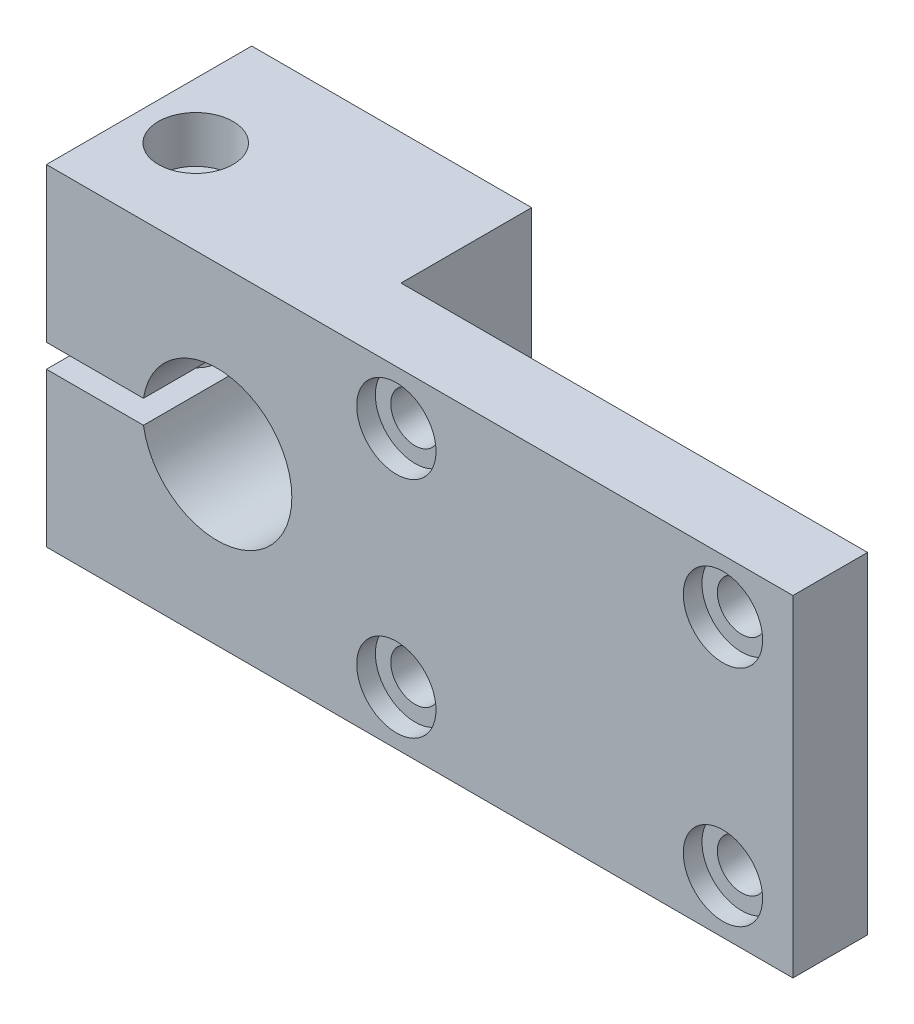
ISO-10303-21;
HEADER;
FILE_DESCRIPTION(('STEP AP214'),'2;1');
FILE_NAME('part.step','',(''),(''),'','','');
FILE_SCHEMA(('AUTOMOTIVE_DESIGN { 1 0 10303 214 1 1 1 1 }'));
ENDSEC;
DATA;
#1=APPLICATION_CONTEXT('core data for automotive mechanical design processes');
#2=APPLICATION_PROTOCOL_DEFINITION('international standard','automotive_design',2000,#1);
#3=PRODUCT_CONTEXT('',#1,'mechanical');
#4=PRODUCT('Part','Part','',(#3));
#5=PRODUCT_RELATED_PRODUCT_CATEGORY('part','',(#4));
#6=PRODUCT_DEFINITION_FORMATION('','',#4);
#7=PRODUCT_DEFINITION_CONTEXT('part definition',#1,'design');
#8=PRODUCT_DEFINITION('design','',#6,#7);
#9=PRODUCT_DEFINITION_SHAPE('','',#8);
#10=(LENGTH_UNIT() NAMED_UNIT(*) SI_UNIT(.MILLI.,.METRE.));
#11=(NAMED_UNIT(*) PLANE_ANGLE_UNIT() SI_UNIT($,.RADIAN.));
#12=(NAMED_UNIT(*) SI_UNIT($,.STERADIAN.) SOLID_ANGLE_UNIT());
#13=UNCERTAINTY_MEASURE_WITH_UNIT(LENGTH_MEASURE(1.E-05),#10,'distance_accuracy_value','');
#14=(GEOMETRIC_REPRESENTATION_CONTEXT(3) GLOBAL_UNCERTAINTY_ASSIGNED_CONTEXT((#13)) GLOBAL_UNIT_ASSIGNED_CONTEXT((#10,
#11,#12)) REPRESENTATION_CONTEXT('',''));
#15=CARTESIAN_POINT('',(0.,0.,0.));
#16=DIRECTION('',(0.,0.,1.));
#17=DIRECTION('',(1.,0.,0.));
#18=AXIS2_PLACEMENT_3D('',#15,#16,#17);
#19=CARTESIAN_POINT('',(-48.9999999999971,0.,-2.));
#20=DIRECTION('',(0.,1.,0.));
#21=DIRECTION('',(0.,0.,1.));
#22=AXIS2_PLACEMENT_3D('',#19,#20,#21);
#23=CYLINDRICAL_SURFACE('',#22,2.65);
#24=CARTESIAN_POINT('',(-48.9999999999971,-14.4999999999999,-2.));
#25=DIRECTION('',(0.,1.,0.));
#26=DIRECTION('',(0.,0.,1.));
#27=AXIS2_PLACEMENT_3D('',#24,#25,#26);
#28=CIRCLE('',#27,2.65);
#29=CARTESIAN_POINT('',(-48.9999999999971,-14.4999999999999,0.649999999999996));
#30=VERTEX_POINT('',#29);
#31=EDGE_CURVE('E296',#30,#30,#28,.T.);
#32=ORIENTED_EDGE('',*,*,#31,.F.);
#33=EDGE_LOOP('',(#32));
#34=FACE_BOUND('',#33,.T.);
#35=CARTESIAN_POINT('',(-48.9999999999971,-3.,-2.));
#36=DIRECTION('',(0.,1.,0.));
#37=DIRECTION('',(-1.,0.,0.));
#38=AXIS2_PLACEMENT_3D('',#35,#36,#37);
#39=CIRCLE('',#38,2.65);
#40=CARTESIAN_POINT('',(-51.6499999999971,-3.,-2.));
#41=VERTEX_POINT('',#40);
#42=EDGE_CURVE('E240',#41,#41,#39,.F.);
#43=ORIENTED_EDGE('',*,*,#42,.F.);
#44=EDGE_LOOP('',(#43));
#45=FACE_BOUND('',#44,.T.);
#46=ADVANCED_FACE('F36',(#34,#45),#23,.F.);
#47=CARTESIAN_POINT('',(-48.9999999999971,-16.9999999999999,-2.));
#48=DIRECTION('',(0.,-1.,0.));
#49=DIRECTION('',(0.,0.,-1.));
#50=AXIS2_PLACEMENT_3D('',#47,#48,#49);
#51=CIRCLE('',#50,2.65);
#52=CARTESIAN_POINT('',(-48.9999999999971,-16.9999999999999,-4.65));
#53=VERTEX_POINT('',#52);
#54=EDGE_CURVE('E301',#53,#53,#51,.T.);
#55=ORIENTED_EDGE('',*,*,#54,.F.);
#56=EDGE_LOOP('',(#55));
#57=FACE_BOUND('',#56,.T.);
#58=CARTESIAN_POINT('',(-48.9999999999971,-23.4999999999999,-2.));
#59=DIRECTION('',(0.,-1.,0.));
#60=DIRECTION('',(0.,0.,-1.));
#61=AXIS2_PLACEMENT_3D('',#58,#59,#60);
#62=CIRCLE('',#61,2.65);
#63=CARTESIAN_POINT('',(-48.9999999999971,-23.4999999999999,-4.65));
#64=VERTEX_POINT('',#63);
#65=EDGE_CURVE('E281',#64,#64,#62,.F.);
#66=ORIENTED_EDGE('',*,*,#65,.F.);
#67=EDGE_LOOP('',(#66));
#68=FACE_BOUND('',#67,.T.);
#69=ADVANCED_FACE('F462',(#57,#68),#23,.F.);
#70=CARTESIAN_POINT('',(-54.9999999999971,0.,0.));
#71=DIRECTION('',(-1.,0.,0.));
#72=DIRECTION('',(0.,-1.,0.));
#73=AXIS2_PLACEMENT_3D('',#70,#71,#72);
#74=PLANE('',#73);
#75=DIRECTION('',(0.,-1.,0.));
#76=VECTOR('',#75,1.);
#77=CARTESIAN_POINT('',(-54.9999999999971,26.5000000000001,-14.));
#78=LINE('',#77,#76);
#79=CARTESIAN_POINT('',(-54.9999999999971,2.,-14.));
#80=VERTEX_POINT('',#79);
#81=CARTESIAN_POINT('',(-54.9999999999971,-14.4999999999999,-14.));
#82=VERTEX_POINT('',#81);
#83=EDGE_CURVE('E244',#80,#82,#78,.T.);
#84=ORIENTED_EDGE('',*,*,#83,.T.);
#85=DIRECTION('',(0.,0.,1.));
#86=VECTOR('',#85,1.);
#87=CARTESIAN_POINT('',(-54.9999999999971,-14.4999999999999,-48.));
#88=LINE('',#87,#86);
#89=CARTESIAN_POINT('',(-54.9999999999971,-14.4999999999999,8.));
#90=VERTEX_POINT('',#89);
#91=EDGE_CURVE('E309',#82,#90,#88,.T.);
#92=ORIENTED_EDGE('',*,*,#91,.T.);
#93=DIRECTION('',(0.,1.,0.));
#94=VECTOR('',#93,1.);
#95=CARTESIAN_POINT('',(-54.9999999999971,-31.4999999999999,8.));
#96=LINE('',#95,#94);
#97=CARTESIAN_POINT('',(-54.9999999999971,2.,8.));
#98=VERTEX_POINT('',#97);
#99=EDGE_CURVE('E317',#90,#98,#96,.T.);
#100=ORIENTED_EDGE('',*,*,#99,.T.);
#101=DIRECTION('',(0.,0.,1.));
#102=VECTOR('',#101,1.);
#103=CARTESIAN_POINT('',(-54.9999999999971,2.,-14.));
#104=LINE('',#103,#102);
#105=EDGE_CURVE('E189',#80,#98,#104,.T.);
#106=ORIENTED_EDGE('',*,*,#105,.F.);
#107=EDGE_LOOP('',(#84,#92,#100,#106));
#108=FACE_BOUND('',#107,.T.);
#109=ADVANCED_FACE('F418',(#108),#74,.T.);
#110=CARTESIAN_POINT('',(0.,0.,8.));
#111=DIRECTION('',(0.,0.,1.));
#112=DIRECTION('',(1.,0.,0.));
#113=AXIS2_PLACEMENT_3D('',#110,#111,#112);
#114=PLANE('',#113);
#115=CARTESIAN_POINT('',(-17.4999999999971,-27.7499999999999,8.));
#116=DIRECTION('',(0.,0.,1.));
#117=DIRECTION('',(1.,0.,0.));
#118=AXIS2_PLACEMENT_3D('',#115,#116,#117);
#119=CIRCLE('',#118,4.25);
#120=CARTESIAN_POINT('',(-13.2499999999971,-27.7499999999999,8.));
#121=VERTEX_POINT('',#120);
#122=EDGE_CURVE('E381',#121,#121,#119,.T.);
#123=ORIENTED_EDGE('',*,*,#122,.F.);
#124=EDGE_LOOP('',(#123));
#125=FACE_BOUND('',#124,.T.);
#126=CARTESIAN_POINT('',(17.5000000000029,-27.7499999999999,8.));
#127=DIRECTION('',(0.,0.,1.));
#128=DIRECTION('',(1.,0.,0.));
#129=AXIS2_PLACEMENT_3D('',#126,#127,#128);
#130=CIRCLE('',#129,4.25);
#131=CARTESIAN_POINT('',(21.7500000000029,-27.7499999999999,8.));
#132=VERTEX_POINT('',#131);
#133=EDGE_CURVE('E380',#132,#132,#130,.T.);
#134=ORIENTED_EDGE('',*,*,#133,.F.);
#135=EDGE_LOOP('',(#134));
#136=FACE_BOUND('',#135,.T.);
#137=CARTESIAN_POINT('',(17.5000000000029,-3.74999999999989,8.));
#138=DIRECTION('',(0.,0.,1.));
#139=DIRECTION('',(1.,0.,0.));
#140=AXIS2_PLACEMENT_3D('',#137,#138,#139);
#141=CIRCLE('',#140,4.25);
#142=CARTESIAN_POINT('',(21.7500000000029,-3.74999999999989,8.));
#143=VERTEX_POINT('',#142);
#144=EDGE_CURVE('E397',#143,#143,#141,.T.);
#145=ORIENTED_EDGE('',*,*,#144,.F.);
#146=EDGE_LOOP('',(#145));
#147=FACE_BOUND('',#146,.T.);
#148=CARTESIAN_POINT('',(-17.4999999999971,-3.74999999999989,8.));
#149=DIRECTION('',(0.,0.,1.));
#150=DIRECTION('',(1.,0.,0.));
#151=AXIS2_PLACEMENT_3D('',#148,#149,#150);
#152=CIRCLE('',#151,4.25);
#153=CARTESIAN_POINT('',(-13.2499999999971,-3.74999999999989,8.));
#154=VERTEX_POINT('',#153);
#155=EDGE_CURVE('E391',#154,#154,#152,.T.);
#156=ORIENTED_EDGE('',*,*,#155,.F.);
#157=EDGE_LOOP('',(#156));
#158=FACE_BOUND('',#157,.T.);
#159=DIRECTION('',(-1.,0.,0.));
#160=VECTOR('',#159,1.);
#161=CARTESIAN_POINT('',(-54.9999999999971,-14.4999999999999,8.));
#162=LINE('',#161,#160);
#163=CARTESIAN_POINT('',(-44.6017403146367,-14.4999999999999,8.));
#164=VERTEX_POINT('',#163);
#165=EDGE_CURVE('E304',#164,#90,#162,.T.);
#166=ORIENTED_EDGE('',*,*,#165,.F.);
#167=CARTESIAN_POINT('',(-36.6999999999971,-15.7499999999999,8.));
#168=DIRECTION('',(0.,0.,1.));
#169=DIRECTION('',(1.,0.,0.));
#170=AXIS2_PLACEMENT_3D('',#167,#168,#169);
#171=CIRCLE('',#170,8.);
#172=CARTESIAN_POINT('',(-44.6017403146367,-16.9999999999999,8.));
#173=VERTEX_POINT('',#172);
#174=EDGE_CURVE('E312',#173,#164,#171,.T.);
#175=ORIENTED_EDGE('',*,*,#174,.F.);
#176=DIRECTION('',(1.,0.,0.));
#177=VECTOR('',#176,1.);
#178=CARTESIAN_POINT('',(-54.9999999999971,-16.9999999999999,8.));
#179=LINE('',#178,#177);
#180=CARTESIAN_POINT('',(-54.9999999999971,-16.9999999999999,8.));
#181=VERTEX_POINT('',#180);
#182=EDGE_CURVE('E300',#181,#173,#179,.T.);
#183=ORIENTED_EDGE('',*,*,#182,.F.);
#184=CARTESIAN_POINT('',(-54.9999999999971,-33.4999999999999,8.));
#185=VERTEX_POINT('',#184);
#186=EDGE_CURVE('E318',#185,#181,#96,.T.);
#187=ORIENTED_EDGE('',*,*,#186,.F.);
#188=DIRECTION('',(-1.,0.,0.));
#189=VECTOR('',#188,1.);
#190=CARTESIAN_POINT('',(25.0000000000029,-33.4999999999999,8.));
#191=LINE('',#190,#189);
#192=CARTESIAN_POINT('',(25.0000000000029,-33.4999999999999,8.));
#193=VERTEX_POINT('',#192);
#194=EDGE_CURVE('E213',#193,#185,#191,.T.);
#195=ORIENTED_EDGE('',*,*,#194,.F.);
#196=DIRECTION('',(0.,1.,0.));
#197=VECTOR('',#196,1.);
#198=CARTESIAN_POINT('',(25.0000000000029,-31.4999999999999,8.));
#199=LINE('',#198,#197);
#200=CARTESIAN_POINT('',(25.0000000000029,2.,8.));
#201=VERTEX_POINT('',#200);
#202=EDGE_CURVE('E163',#193,#201,#199,.T.);
#203=ORIENTED_EDGE('',*,*,#202,.T.);
#204=DIRECTION('',(1.,0.,0.));
#205=VECTOR('',#204,1.);
#206=CARTESIAN_POINT('',(-54.9999999999971,2.,8.));
#207=LINE('',#206,#205);
#208=EDGE_CURVE('E192',#98,#201,#207,.T.);
#209=ORIENTED_EDGE('',*,*,#208,.F.);
#210=ORIENTED_EDGE('',*,*,#99,.F.);
#211=EDGE_LOOP('',(#166,#175,#183,#187,#195,#203,#209,#210));
#212=FACE_BOUND('',#211,.T.);
#213=ADVANCED_FACE('F415',(#125,#136,#147,#158,#212),#114,.T.);
#214=CARTESIAN_POINT('',(0.,0.,0.));
#215=DIRECTION('',(0.,0.,1.));
#216=DIRECTION('',(1.,0.,0.));
#217=AXIS2_PLACEMENT_3D('',#214,#215,#216);
#218=PLANE('',#217);
#219=CARTESIAN_POINT('',(-17.4999999999971,-27.7499999999999,0.));
#220=DIRECTION('',(0.,0.,1.));
#221=DIRECTION('',(1.,0.,0.));
#222=AXIS2_PLACEMENT_3D('',#219,#220,#221);
#223=CIRCLE('',#222,2.6);
#224=CARTESIAN_POINT('',(-14.8999999999971,-27.7499999999999,0.));
#225=VERTEX_POINT('',#224);
#226=EDGE_CURVE('E184',#225,#225,#223,.T.);
#227=ORIENTED_EDGE('',*,*,#226,.T.);
#228=EDGE_LOOP('',(#227));
#229=FACE_BOUND('',#228,.T.);
#230=CARTESIAN_POINT('',(17.5000000000029,-27.7499999999999,0.));
#231=DIRECTION('',(0.,0.,1.));
#232=DIRECTION('',(1.,0.,0.));
#233=AXIS2_PLACEMENT_3D('',#230,#231,#232);
#234=CIRCLE('',#233,2.6);
#235=CARTESIAN_POINT('',(20.1000000000029,-27.7499999999999,0.));
#236=VERTEX_POINT('',#235);
#237=EDGE_CURVE('E343',#236,#236,#234,.T.);
#238=ORIENTED_EDGE('',*,*,#237,.T.);
#239=EDGE_LOOP('',(#238));
#240=FACE_BOUND('',#239,.T.);
#241=CARTESIAN_POINT('',(17.5000000000029,-3.74999999999989,0.));
#242=DIRECTION('',(0.,0.,1.));
#243=DIRECTION('',(1.,0.,0.));
#244=AXIS2_PLACEMENT_3D('',#241,#242,#243);
#245=CIRCLE('',#244,2.6);
#246=CARTESIAN_POINT('',(20.1000000000029,-3.74999999999989,0.));
#247=VERTEX_POINT('',#246);
#248=EDGE_CURVE('E347',#247,#247,#245,.T.);
#249=ORIENTED_EDGE('',*,*,#248,.T.);
#250=EDGE_LOOP('',(#249));
#251=FACE_BOUND('',#250,.T.);
#252=CARTESIAN_POINT('',(-17.4999999999971,-3.74999999999989,0.));
#253=DIRECTION('',(0.,0.,1.));
#254=DIRECTION('',(1.,0.,0.));
#255=AXIS2_PLACEMENT_3D('',#252,#253,#254);
#256=CIRCLE('',#255,2.6);
#257=CARTESIAN_POINT('',(-14.8999999999971,-3.74999999999989,0.));
#258=VERTEX_POINT('',#257);
#259=EDGE_CURVE('E350',#258,#258,#256,.T.);
#260=ORIENTED_EDGE('',*,*,#259,.T.);
#261=EDGE_LOOP('',(#260));
#262=FACE_BOUND('',#261,.T.);
#263=DIRECTION('',(0.,1.,0.));
#264=VECTOR('',#263,1.);
#265=CARTESIAN_POINT('',(25.0000000000029,-31.4999999999999,0.));
#266=LINE('',#265,#264);
#267=CARTESIAN_POINT('',(25.0000000000029,-33.4999999999999,0.));
#268=VERTEX_POINT('',#267);
#269=CARTESIAN_POINT('',(25.0000000000029,2.,0.));
#270=VERTEX_POINT('',#269);
#271=EDGE_CURVE('E164',#268,#270,#266,.T.);
#272=ORIENTED_EDGE('',*,*,#271,.F.);
#273=DIRECTION('',(1.,0.,0.));
#274=VECTOR('',#273,1.);
#275=CARTESIAN_POINT('',(-24.9999999999971,-33.4999999999999,0.));
#276=LINE('',#275,#274);
#277=CARTESIAN_POINT('',(-24.9999999999971,-33.4999999999999,0.));
#278=VERTEX_POINT('',#277);
#279=EDGE_CURVE('E158',#278,#268,#276,.T.);
#280=ORIENTED_EDGE('',*,*,#279,.F.);
#281=DIRECTION('',(0.,-1.,0.));
#282=VECTOR('',#281,1.);
#283=CARTESIAN_POINT('',(-24.9999999999971,1.09634523681734E-13,0.));
#284=LINE('',#283,#282);
#285=CARTESIAN_POINT('',(-24.9999999999971,2.,0.));
#286=VERTEX_POINT('',#285);
#287=EDGE_CURVE('E152',#286,#278,#284,.T.);
#288=ORIENTED_EDGE('',*,*,#287,.F.);
#289=DIRECTION('',(-1.,0.,0.));
#290=VECTOR('',#289,1.);
#291=CARTESIAN_POINT('',(25.0000000000029,2.,0.));
#292=LINE('',#291,#290);
#293=EDGE_CURVE('E156',#270,#286,#292,.T.);
#294=ORIENTED_EDGE('',*,*,#293,.F.);
#295=EDGE_LOOP('',(#272,#280,#288,#294));
#296=FACE_BOUND('',#295,.T.);
#297=ADVANCED_FACE('F154',(#229,#240,#251,#262,#296),#218,.F.);
#298=CARTESIAN_POINT('',(25.0000000000029,-31.4999999999999,8.));
#299=DIRECTION('',(-1.,0.,0.));
#300=DIRECTION('',(0.,-1.,0.));
#301=AXIS2_PLACEMENT_3D('',#298,#299,#300);
#302=PLANE('',#301);
#303=ORIENTED_EDGE('',*,*,#271,.T.);
#304=DIRECTION('',(0.,0.,-1.));
#305=VECTOR('',#304,1.);
#306=CARTESIAN_POINT('',(25.0000000000029,2.,8.));
#307=LINE('',#306,#305);
#308=EDGE_CURVE('E180',#201,#270,#307,.T.);
#309=ORIENTED_EDGE('',*,*,#308,.F.);
#310=ORIENTED_EDGE('',*,*,#202,.F.);
#311=DIRECTION('',(0.,0.,1.));
#312=VECTOR('',#311,1.);
#313=CARTESIAN_POINT('',(25.0000000000029,-33.4999999999999,0.));
#314=LINE('',#313,#312);
#315=EDGE_CURVE('E225',#268,#193,#314,.T.);
#316=ORIENTED_EDGE('',*,*,#315,.F.);
#317=EDGE_LOOP('',(#303,#309,#310,#316));
#318=FACE_BOUND('',#317,.T.);
#319=ADVANCED_FACE('F38',(#318),#302,.F.);
#320=CARTESIAN_POINT('',(-24.9999999999971,0.,0.));
#321=DIRECTION('',(-1.,0.,0.));
#322=DIRECTION('',(0.,-1.,0.));
#323=AXIS2_PLACEMENT_3D('',#320,#321,#322);
#324=PLANE('',#323);
#325=ORIENTED_EDGE('',*,*,#287,.T.);
#326=DIRECTION('',(0.,0.,1.));
#327=VECTOR('',#326,1.);
#328=CARTESIAN_POINT('',(-24.9999999999971,-33.4999999999999,-14.));
#329=LINE('',#328,#327);
#330=CARTESIAN_POINT('',(-24.9999999999971,-33.4999999999999,-14.));
#331=VERTEX_POINT('',#330);
#332=EDGE_CURVE('E222',#331,#278,#329,.T.);
#333=ORIENTED_EDGE('',*,*,#332,.F.);
#334=DIRECTION('',(0.,-1.,0.));
#335=VECTOR('',#334,1.);
#336=CARTESIAN_POINT('',(-24.9999999999971,26.5000000000001,-14.));
#337=LINE('',#336,#335);
#338=CARTESIAN_POINT('',(-24.9999999999971,2.,-14.));
#339=VERTEX_POINT('',#338);
#340=EDGE_CURVE('E169',#339,#331,#337,.T.);
#341=ORIENTED_EDGE('',*,*,#340,.F.);
#342=DIRECTION('',(0.,0.,-1.));
#343=VECTOR('',#342,1.);
#344=CARTESIAN_POINT('',(-24.9999999999971,2.,0.));
#345=LINE('',#344,#343);
#346=EDGE_CURVE('E167',#286,#339,#345,.T.);
#347=ORIENTED_EDGE('',*,*,#346,.F.);
#348=EDGE_LOOP('',(#325,#333,#341,#347));
#349=FACE_BOUND('',#348,.T.);
#350=ADVANCED_FACE('F168',(#349),#324,.F.);
#351=CARTESIAN_POINT('',(-54.9999999999971,-20.4999999999999,4.));
#352=DIRECTION('',(-1.,0.,0.));
#353=DIRECTION('',(0.,-1.,0.));
#354=AXIS2_PLACEMENT_3D('',#351,#352,#353);
#355=CIRCLE('',#354,1.25);
#356=CARTESIAN_POINT('',(-54.9999999999971,-21.7499999999999,4.));
#357=VERTEX_POINT('',#356);
#358=EDGE_CURVE('E228',#357,#357,#355,.T.);
#359=ORIENTED_EDGE('',*,*,#358,.F.);
#360=EDGE_LOOP('',(#359));
#361=FACE_BOUND('',#360,.T.);
#362=CARTESIAN_POINT('',(-54.9999999999971,-16.9999999999999,-14.));
#363=VERTEX_POINT('',#362);
#364=CARTESIAN_POINT('',(-54.9999999999971,-33.4999999999999,-14.));
#365=VERTEX_POINT('',#364);
#366=EDGE_CURVE('E241',#363,#365,#78,.T.);
#367=ORIENTED_EDGE('',*,*,#366,.T.);
#368=DIRECTION('',(0.,0.,-1.));
#369=VECTOR('',#368,1.);
#370=CARTESIAN_POINT('',(-54.9999999999971,-33.4999999999999,8.));
#371=LINE('',#370,#369);
#372=EDGE_CURVE('E216',#185,#365,#371,.T.);
#373=ORIENTED_EDGE('',*,*,#372,.F.);
#374=ORIENTED_EDGE('',*,*,#186,.T.);
#375=DIRECTION('',(0.,0.,1.));
#376=VECTOR('',#375,1.);
#377=CARTESIAN_POINT('',(-54.9999999999971,-16.9999999999999,-48.));
#378=LINE('',#377,#376);
#379=EDGE_CURVE('E308',#363,#181,#378,.T.);
#380=ORIENTED_EDGE('',*,*,#379,.F.);
#381=EDGE_LOOP('',(#367,#373,#374,#380));
#382=FACE_BOUND('',#381,.T.);
#383=ADVANCED_FACE('F450',(#361,#382),#74,.T.);
#384=CARTESIAN_POINT('',(-36.6999999999971,-15.7499999999999,-52.));
#385=DIRECTION('',(0.,0.,1.));
#386=DIRECTION('',(1.,0.,0.));
#387=AXIS2_PLACEMENT_3D('',#384,#385,#386);
#388=CYLINDRICAL_SURFACE('',#387,8.);
#389=DIRECTION('',(0.,0.,1.));
#390=VECTOR('',#389,1.);
#391=CARTESIAN_POINT('',(-44.6017403146367,-14.4999999999999,-52.));
#392=LINE('',#391,#390);
#393=CARTESIAN_POINT('',(-44.6017403146367,-14.4999999999999,-14.));
#394=VERTEX_POINT('',#393);
#395=EDGE_CURVE('E46',#164,#394,#392,.F.);
#396=ORIENTED_EDGE('',*,*,#395,.T.);
#397=CARTESIAN_POINT('',(-36.6999999999971,-15.7499999999999,-14.));
#398=DIRECTION('',(0.,0.,1.));
#399=DIRECTION('',(1.,0.,0.));
#400=AXIS2_PLACEMENT_3D('',#397,#398,#399);
#401=CIRCLE('',#400,8.);
#402=CARTESIAN_POINT('',(-44.6017403146367,-16.9999999999999,-14.));
#403=VERTEX_POINT('',#402);
#404=EDGE_CURVE('E54',#394,#403,#401,.F.);
#405=ORIENTED_EDGE('',*,*,#404,.T.);
#406=DIRECTION('',(0.,0.,1.));
#407=VECTOR('',#406,1.);
#408=CARTESIAN_POINT('',(-44.6017403146367,-16.9999999999999,-52.));
#409=LINE('',#408,#407);
#410=EDGE_CURVE('E60',#403,#173,#409,.T.);
#411=ORIENTED_EDGE('',*,*,#410,.T.);
#412=ORIENTED_EDGE('',*,*,#174,.T.);
#413=EDGE_LOOP('',(#396,#405,#411,#412));
#414=FACE_BOUND('',#413,.T.);
#415=ADVANCED_FACE('F431',(#414),#388,.F.);
#416=CARTESIAN_POINT('',(-54.9999999999971,-16.9999999999999,-48.));
#417=DIRECTION('',(0.,-1.,0.));
#418=DIRECTION('',(0.,0.,-1.));
#419=AXIS2_PLACEMENT_3D('',#416,#417,#418);
#420=PLANE('',#419);
#421=ORIENTED_EDGE('',*,*,#54,.T.);
#422=EDGE_LOOP('',(#421));
#423=FACE_BOUND('',#422,.T.);
#424=ORIENTED_EDGE('',*,*,#410,.F.);
#425=DIRECTION('',(-1.,0.,0.));
#426=VECTOR('',#425,1.);
#427=CARTESIAN_POINT('',(-54.9999999999971,-16.9999999999999,-14.));
#428=LINE('',#427,#426);
#429=EDGE_CURVE('E249',#403,#363,#428,.T.);
#430=ORIENTED_EDGE('',*,*,#429,.T.);
#431=ORIENTED_EDGE('',*,*,#379,.T.);
#432=ORIENTED_EDGE('',*,*,#182,.T.);
#433=EDGE_LOOP('',(#424,#430,#431,#432));
#434=FACE_BOUND('',#433,.T.);
#435=ADVANCED_FACE('F449',(#423,#434),#420,.F.);
#436=CARTESIAN_POINT('',(-54.9999999999971,-14.4999999999999,-48.));
#437=DIRECTION('',(0.,1.,0.));
#438=DIRECTION('',(0.,0.,1.));
#439=AXIS2_PLACEMENT_3D('',#436,#437,#438);
#440=PLANE('',#439);
#441=ORIENTED_EDGE('',*,*,#31,.T.);
#442=EDGE_LOOP('',(#441));
#443=FACE_BOUND('',#442,.T.);
#444=ORIENTED_EDGE('',*,*,#91,.F.);
#445=DIRECTION('',(1.,0.,0.));
#446=VECTOR('',#445,1.);
#447=CARTESIAN_POINT('',(-54.9999999999971,-14.4999999999999,-14.));
#448=LINE('',#447,#446);
#449=EDGE_CURVE('E11',#82,#394,#448,.T.);
#450=ORIENTED_EDGE('',*,*,#449,.T.);
#451=ORIENTED_EDGE('',*,*,#395,.F.);
#452=ORIENTED_EDGE('',*,*,#165,.T.);
#453=EDGE_LOOP('',(#444,#450,#451,#452));
#454=FACE_BOUND('',#453,.T.);
#455=ADVANCED_FACE('F374',(#443,#454),#440,.F.);
#456=CARTESIAN_POINT('',(-17.4999999999971,-27.7499999999999,6.));
#457=DIRECTION('',(0.,0.,1.));
#458=DIRECTION('',(1.,0.,0.));
#459=AXIS2_PLACEMENT_3D('',#456,#457,#458);
#460=PLANE('',#459);
#461=CARTESIAN_POINT('',(-17.4999999999971,-27.7499999999999,6.));
#462=DIRECTION('',(0.,0.,1.));
#463=DIRECTION('',(1.,0.,0.));
#464=AXIS2_PLACEMENT_3D('',#461,#462,#463);
#465=CIRCLE('',#464,2.6);
#466=CARTESIAN_POINT('',(-14.8999999999971,-27.7499999999999,6.));
#467=VERTEX_POINT('',#466);
#468=EDGE_CURVE('E40',#467,#467,#465,.T.);
#469=ORIENTED_EDGE('',*,*,#468,.F.);
#470=EDGE_LOOP('',(#469));
#471=FACE_BOUND('',#470,.T.);
#472=CARTESIAN_POINT('',(-17.4999999999971,-27.7499999999999,6.));
#473=DIRECTION('',(0.,0.,1.));
#474=DIRECTION('',(1.,0.,0.));
#475=AXIS2_PLACEMENT_3D('',#472,#473,#474);
#476=CIRCLE('',#475,4.25);
#477=CARTESIAN_POINT('',(-13.2499999999971,-27.7499999999999,6.));
#478=VERTEX_POINT('',#477);
#479=EDGE_CURVE('E378',#478,#478,#476,.T.);
#480=ORIENTED_EDGE('',*,*,#479,.T.);
#481=EDGE_LOOP('',(#480));
#482=FACE_BOUND('',#481,.T.);
#483=ADVANCED_FACE('F370',(#471,#482),#460,.T.);
#484=CARTESIAN_POINT('',(-17.4999999999971,-3.74999999999989,6.));
#485=DIRECTION('',(0.,0.,1.));
#486=DIRECTION('',(1.,0.,0.));
#487=AXIS2_PLACEMENT_3D('',#484,#485,#486);
#488=PLANE('',#487);
#489=CARTESIAN_POINT('',(-17.4999999999971,-3.74999999999989,6.));
#490=DIRECTION('',(0.,0.,1.));
#491=DIRECTION('',(1.,0.,0.));
#492=AXIS2_PLACEMENT_3D('',#489,#490,#491);
#493=CIRCLE('',#492,2.6);
#494=CARTESIAN_POINT('',(-14.8999999999971,-3.74999999999989,6.));
#495=VERTEX_POINT('',#494);
#496=EDGE_CURVE('E348',#495,#495,#493,.T.);
#497=ORIENTED_EDGE('',*,*,#496,.F.);
#498=EDGE_LOOP('',(#497));
#499=FACE_BOUND('',#498,.T.);
#500=CARTESIAN_POINT('',(-17.4999999999971,-3.74999999999989,6.));
#501=DIRECTION('',(0.,0.,1.));
#502=DIRECTION('',(1.,0.,0.));
#503=AXIS2_PLACEMENT_3D('',#500,#501,#502);
#504=CIRCLE('',#503,4.25);
#505=CARTESIAN_POINT('',(-13.2499999999971,-3.74999999999989,6.));
#506=VERTEX_POINT('',#505);
#507=EDGE_CURVE('E344',#506,#506,#504,.T.);
#508=ORIENTED_EDGE('',*,*,#507,.T.);
#509=EDGE_LOOP('',(#508));
#510=FACE_BOUND('',#509,.T.);
#511=ADVANCED_FACE('F373',(#499,#510),#488,.T.);
#512=CARTESIAN_POINT('',(17.5000000000029,-3.74999999999989,6.));
#513=DIRECTION('',(0.,0.,1.));
#514=DIRECTION('',(1.,0.,0.));
#515=AXIS2_PLACEMENT_3D('',#512,#513,#514);
#516=PLANE('',#515);
#517=CARTESIAN_POINT('',(17.5000000000029,-3.74999999999989,6.));
#518=DIRECTION('',(0.,0.,1.));
#519=DIRECTION('',(1.,0.,0.));
#520=AXIS2_PLACEMENT_3D('',#517,#518,#519);
#521=CIRCLE('',#520,2.6);
#522=CARTESIAN_POINT('',(20.1000000000029,-3.74999999999989,6.));
#523=VERTEX_POINT('',#522);
#524=EDGE_CURVE('E345',#523,#523,#521,.T.);
#525=ORIENTED_EDGE('',*,*,#524,.F.);
#526=EDGE_LOOP('',(#525));
#527=FACE_BOUND('',#526,.T.);
#528=CARTESIAN_POINT('',(17.5000000000029,-3.74999999999989,6.));
#529=DIRECTION('',(0.,0.,1.));
#530=DIRECTION('',(1.,0.,0.));
#531=AXIS2_PLACEMENT_3D('',#528,#529,#530);
#532=CIRCLE('',#531,4.25);
#533=CARTESIAN_POINT('',(21.7500000000029,-3.74999999999989,6.));
#534=VERTEX_POINT('',#533);
#535=EDGE_CURVE('E393',#534,#534,#532,.T.);
#536=ORIENTED_EDGE('',*,*,#535,.T.);
#537=EDGE_LOOP('',(#536));
#538=FACE_BOUND('',#537,.T.);
#539=ADVANCED_FACE('F479',(#527,#538),#516,.T.);
#540=CARTESIAN_POINT('',(17.5000000000029,-27.7499999999999,6.));
#541=DIRECTION('',(0.,0.,1.));
#542=DIRECTION('',(1.,0.,0.));
#543=AXIS2_PLACEMENT_3D('',#540,#541,#542);
#544=PLANE('',#543);
#545=CARTESIAN_POINT('',(17.5000000000029,-27.7499999999999,6.));
#546=DIRECTION('',(0.,0.,1.));
#547=DIRECTION('',(1.,0.,0.));
#548=AXIS2_PLACEMENT_3D('',#545,#546,#547);
#549=CIRCLE('',#548,2.6);
#550=CARTESIAN_POINT('',(20.1000000000029,-27.7499999999999,6.));
#551=VERTEX_POINT('',#550);
#552=EDGE_CURVE('E340',#551,#551,#549,.T.);
#553=ORIENTED_EDGE('',*,*,#552,.F.);
#554=EDGE_LOOP('',(#553));
#555=FACE_BOUND('',#554,.T.);
#556=CARTESIAN_POINT('',(17.5000000000029,-27.7499999999999,6.));
#557=DIRECTION('',(0.,0.,1.));
#558=DIRECTION('',(1.,0.,0.));
#559=AXIS2_PLACEMENT_3D('',#556,#557,#558);
#560=CIRCLE('',#559,4.25);
#561=CARTESIAN_POINT('',(21.7500000000029,-27.7499999999999,6.));
#562=VERTEX_POINT('',#561);
#563=EDGE_CURVE('E384',#562,#562,#560,.T.);
#564=ORIENTED_EDGE('',*,*,#563,.T.);
#565=EDGE_LOOP('',(#564));
#566=FACE_BOUND('',#565,.T.);
#567=ADVANCED_FACE('F406',(#555,#566),#544,.T.);
#568=CARTESIAN_POINT('',(0.,-23.4999999999999,0.));
#569=DIRECTION('',(0.,-1.,0.));
#570=DIRECTION('',(0.,0.,-1.));
#571=AXIS2_PLACEMENT_3D('',#568,#569,#570);
#572=PLANE('',#571);
#573=DIRECTION('',(0.,0.,1.));
#574=VECTOR('',#573,1.);
#575=CARTESIAN_POINT('',(-44.9999999999971,-23.4999999999999,-4.3094010767585));
#576=LINE('',#575,#574);
#577=CARTESIAN_POINT('',(-44.9999999999971,-23.4999999999999,-4.3094010767585));
#578=VERTEX_POINT('',#577);
#579=CARTESIAN_POINT('',(-44.9999999999971,-23.4999999999999,0.309401076758518));
#580=VERTEX_POINT('',#579);
#581=EDGE_CURVE('E253',#578,#580,#576,.T.);
#582=ORIENTED_EDGE('',*,*,#581,.T.);
#583=DIRECTION('',(-0.86602540378444,0.,0.499999999999998));
#584=VECTOR('',#583,1.);
#585=CARTESIAN_POINT('',(-44.9999999999971,-23.4999999999999,0.309401076758518));
#586=LINE('',#585,#584);
#587=CARTESIAN_POINT('',(-48.9999999999971,-23.4999999999999,2.61880215351701));
#588=VERTEX_POINT('',#587);
#589=EDGE_CURVE('E257',#580,#588,#586,.T.);
#590=ORIENTED_EDGE('',*,*,#589,.T.);
#591=DIRECTION('',(-0.866025403784439,0.,-0.5));
#592=VECTOR('',#591,1.);
#593=CARTESIAN_POINT('',(-48.9999999999971,-23.4999999999999,2.61880215351701));
#594=LINE('',#593,#592);
#595=CARTESIAN_POINT('',(-52.9999999999971,-23.4999999999999,0.309401076758501));
#596=VERTEX_POINT('',#595);
#597=EDGE_CURVE('E261',#588,#596,#594,.T.);
#598=ORIENTED_EDGE('',*,*,#597,.T.);
#599=DIRECTION('',(0.,0.,-1.));
#600=VECTOR('',#599,1.);
#601=CARTESIAN_POINT('',(-52.9999999999971,-23.4999999999999,0.309401076758501));
#602=LINE('',#601,#600);
#603=CARTESIAN_POINT('',(-52.9999999999971,-23.4999999999999,-4.30940107675851));
#604=VERTEX_POINT('',#603);
#605=EDGE_CURVE('E265',#596,#604,#602,.T.);
#606=ORIENTED_EDGE('',*,*,#605,.T.);
#607=DIRECTION('',(0.866025403784441,0.,-0.499999999999997));
#608=VECTOR('',#607,1.);
#609=CARTESIAN_POINT('',(-52.9999999999971,-23.4999999999999,-4.30940107675851));
#610=LINE('',#609,#608);
#611=CARTESIAN_POINT('',(-48.9999999999971,-23.4999999999999,-6.61880215351701));
#612=VERTEX_POINT('',#611);
#613=EDGE_CURVE('E269',#604,#612,#610,.T.);
#614=ORIENTED_EDGE('',*,*,#613,.T.);
#615=DIRECTION('',(0.866025403784437,0.,0.500000000000003));
#616=VECTOR('',#615,1.);
#617=CARTESIAN_POINT('',(-48.9999999999971,-23.4999999999999,-6.61880215351701));
#618=LINE('',#617,#616);
#619=EDGE_CURVE('E273',#612,#578,#618,.T.);
#620=ORIENTED_EDGE('',*,*,#619,.T.);
#621=EDGE_LOOP('',(#582,#590,#598,#606,#614,#620));
#622=FACE_BOUND('',#621,.T.);
#623=ORIENTED_EDGE('',*,*,#65,.T.);
#624=EDGE_LOOP('',(#623));
#625=FACE_BOUND('',#624,.T.);
#626=ADVANCED_FACE('F478',(#622,#625),#572,.T.);
#627=CARTESIAN_POINT('',(-44.9999999999971,-23.4999999999999,-4.3094010767585));
#628=DIRECTION('',(1.,0.,0.));
#629=DIRECTION('',(0.,0.,-1.));
#630=AXIS2_PLACEMENT_3D('',#627,#628,#629);
#631=PLANE('',#630);
#632=DIRECTION('',(0.,-1.,0.));
#633=VECTOR('',#632,1.);
#634=CARTESIAN_POINT('',(-44.9999999999971,-23.4999999999999,-4.3094010767585));
#635=LINE('',#634,#633);
#636=CARTESIAN_POINT('',(-44.9999999999971,-33.4999999999999,-4.3094010767585));
#637=VERTEX_POINT('',#636);
#638=EDGE_CURVE('E278',#578,#637,#635,.T.);
#639=ORIENTED_EDGE('',*,*,#638,.T.);
#640=DIRECTION('',(0.,0.,1.));
#641=VECTOR('',#640,1.);
#642=CARTESIAN_POINT('',(-44.9999999999971,-33.4999999999999,-4.3094010767585));
#643=LINE('',#642,#641);
#644=CARTESIAN_POINT('',(-44.9999999999971,-33.4999999999999,0.309401076758517));
#645=VERTEX_POINT('',#644);
#646=EDGE_CURVE('E207',#637,#645,#643,.T.);
#647=ORIENTED_EDGE('',*,*,#646,.T.);
#648=DIRECTION('',(0.,-1.,0.));
#649=VECTOR('',#648,1.);
#650=CARTESIAN_POINT('',(-44.9999999999971,-23.4999999999999,0.309401076758518));
#651=LINE('',#650,#649);
#652=EDGE_CURVE('E277',#580,#645,#651,.T.);
#653=ORIENTED_EDGE('',*,*,#652,.F.);
#654=ORIENTED_EDGE('',*,*,#581,.F.);
#655=EDGE_LOOP('',(#639,#647,#653,#654));
#656=FACE_BOUND('',#655,.T.);
#657=ADVANCED_FACE('F473',(#656),#631,.F.);
#658=CARTESIAN_POINT('',(-48.9999999999971,-23.4999999999999,-6.61880215351701));
#659=DIRECTION('',(0.500000000000003,0.,-0.866025403784437));
#660=DIRECTION('',(-0.866025403784437,0.,-0.500000000000003));
#661=AXIS2_PLACEMENT_3D('',#658,#659,#660);
#662=PLANE('',#661);
#663=DIRECTION('',(0.,-1.,0.));
#664=VECTOR('',#663,1.);
#665=CARTESIAN_POINT('',(-48.9999999999971,-23.4999999999999,-6.61880215351701));
#666=LINE('',#665,#664);
#667=CARTESIAN_POINT('',(-48.9999999999971,-33.4999999999999,-6.61880215351701));
#668=VERTEX_POINT('',#667);
#669=EDGE_CURVE('E282',#612,#668,#666,.T.);
#670=ORIENTED_EDGE('',*,*,#669,.T.);
#671=DIRECTION('',(0.866025403784437,0.,0.500000000000003));
#672=VECTOR('',#671,1.);
#673=CARTESIAN_POINT('',(-48.9999999999971,-33.4999999999999,-6.61880215351701));
#674=LINE('',#673,#672);
#675=EDGE_CURVE('E204',#668,#637,#674,.T.);
#676=ORIENTED_EDGE('',*,*,#675,.T.);
#677=ORIENTED_EDGE('',*,*,#638,.F.);
#678=ORIENTED_EDGE('',*,*,#619,.F.);
#679=EDGE_LOOP('',(#670,#676,#677,#678));
#680=FACE_BOUND('',#679,.T.);
#681=ADVANCED_FACE('F504',(#680),#662,.F.);
#682=CARTESIAN_POINT('',(-52.9999999999971,-23.4999999999999,-4.30940107675851));
#683=DIRECTION('',(-0.499999999999997,0.,-0.866025403784441));
#684=DIRECTION('',(-0.866025403784441,0.,0.499999999999997));
#685=AXIS2_PLACEMENT_3D('',#682,#683,#684);
#686=PLANE('',#685);
#687=DIRECTION('',(0.,-1.,0.));
#688=VECTOR('',#687,1.);
#689=CARTESIAN_POINT('',(-52.9999999999971,-23.4999999999999,-4.30940107675851));
#690=LINE('',#689,#688);
#691=CARTESIAN_POINT('',(-52.9999999999971,-33.4999999999999,-4.30940107675851));
#692=VERTEX_POINT('',#691);
#693=EDGE_CURVE('E285',#604,#692,#690,.T.);
#694=ORIENTED_EDGE('',*,*,#693,.T.);
#695=DIRECTION('',(0.866025403784441,0.,-0.499999999999997));
#696=VECTOR('',#695,1.);
#697=CARTESIAN_POINT('',(-52.9999999999971,-33.4999999999999,-4.30940107675851));
#698=LINE('',#697,#696);
#699=EDGE_CURVE('E201',#692,#668,#698,.T.);
#700=ORIENTED_EDGE('',*,*,#699,.T.);
#701=ORIENTED_EDGE('',*,*,#669,.F.);
#702=ORIENTED_EDGE('',*,*,#613,.F.);
#703=EDGE_LOOP('',(#694,#700,#701,#702));
#704=FACE_BOUND('',#703,.T.);
#705=ADVANCED_FACE('F511',(#704),#686,.F.);
#706=CARTESIAN_POINT('',(-52.9999999999971,-23.4999999999999,0.309401076758501));
#707=DIRECTION('',(-1.,0.,0.));
#708=DIRECTION('',(0.,0.,1.));
#709=AXIS2_PLACEMENT_3D('',#706,#707,#708);
#710=PLANE('',#709);
#711=DIRECTION('',(0.,-1.,0.));
#712=VECTOR('',#711,1.);
#713=CARTESIAN_POINT('',(-52.9999999999971,-23.4999999999999,0.309401076758501));
#714=LINE('',#713,#712);
#715=CARTESIAN_POINT('',(-52.9999999999971,-33.4999999999999,0.309401076758501));
#716=VERTEX_POINT('',#715);
#717=EDGE_CURVE('E288',#596,#716,#714,.T.);
#718=ORIENTED_EDGE('',*,*,#717,.T.);
#719=DIRECTION('',(0.,0.,-1.));
#720=VECTOR('',#719,1.);
#721=CARTESIAN_POINT('',(-52.9999999999971,-33.4999999999999,0.309401076758501));
#722=LINE('',#721,#720);
#723=EDGE_CURVE('E198',#716,#692,#722,.T.);
#724=ORIENTED_EDGE('',*,*,#723,.T.);
#725=ORIENTED_EDGE('',*,*,#693,.F.);
#726=ORIENTED_EDGE('',*,*,#605,.F.);
#727=EDGE_LOOP('',(#718,#724,#725,#726));
#728=FACE_BOUND('',#727,.T.);
#729=ADVANCED_FACE('F515',(#728),#710,.F.);
#730=CARTESIAN_POINT('',(-48.9999999999971,-23.4999999999999,2.61880215351701));
#731=DIRECTION('',(-0.5,0.,0.866025403784439));
#732=DIRECTION('',(0.866025403784439,0.,0.5));
#733=AXIS2_PLACEMENT_3D('',#730,#731,#732);
#734=PLANE('',#733);
#735=DIRECTION('',(0.,-1.,0.));
#736=VECTOR('',#735,1.);
#737=CARTESIAN_POINT('',(-48.9999999999971,-23.4999999999999,2.61880215351701));
#738=LINE('',#737,#736);
#739=CARTESIAN_POINT('',(-48.9999999999971,-33.4999999999999,2.61880215351701));
#740=VERTEX_POINT('',#739);
#741=EDGE_CURVE('E291',#588,#740,#738,.T.);
#742=ORIENTED_EDGE('',*,*,#741,.T.);
#743=DIRECTION('',(-0.866025403784439,0.,-0.5));
#744=VECTOR('',#743,1.);
#745=CARTESIAN_POINT('',(-48.9999999999971,-33.4999999999999,2.61880215351701));
#746=LINE('',#745,#744);
#747=EDGE_CURVE('E195',#740,#716,#746,.T.);
#748=ORIENTED_EDGE('',*,*,#747,.T.);
#749=ORIENTED_EDGE('',*,*,#717,.F.);
#750=ORIENTED_EDGE('',*,*,#597,.F.);
#751=EDGE_LOOP('',(#742,#748,#749,#750));
#752=FACE_BOUND('',#751,.T.);
#753=ADVANCED_FACE('F519',(#752),#734,.F.);
#754=CARTESIAN_POINT('',(-44.9999999999971,-23.4999999999999,0.309401076758518));
#755=DIRECTION('',(0.499999999999998,0.,0.86602540378444));
#756=DIRECTION('',(0.86602540378444,0.,-0.499999999999998));
#757=AXIS2_PLACEMENT_3D('',#754,#755,#756);
#758=PLANE('',#757);
#759=ORIENTED_EDGE('',*,*,#652,.T.);
#760=DIRECTION('',(-0.86602540378444,0.,0.499999999999997));
#761=VECTOR('',#760,1.);
#762=CARTESIAN_POINT('',(-44.9999999999971,-33.4999999999999,0.309401076758519));
#763=LINE('',#762,#761);
#764=EDGE_CURVE('E210',#645,#740,#763,.T.);
#765=ORIENTED_EDGE('',*,*,#764,.T.);
#766=ORIENTED_EDGE('',*,*,#741,.F.);
#767=ORIENTED_EDGE('',*,*,#589,.F.);
#768=EDGE_LOOP('',(#759,#765,#766,#767));
#769=FACE_BOUND('',#768,.T.);
#770=ADVANCED_FACE('F522',(#769),#758,.F.);
#771=CARTESIAN_POINT('',(-54.9999999999971,26.5000000000001,-14.));
#772=DIRECTION('',(0.,0.,1.));
#773=DIRECTION('',(1.,0.,0.));
#774=AXIS2_PLACEMENT_3D('',#771,#772,#773);
#775=PLANE('',#774);
#776=ORIENTED_EDGE('',*,*,#340,.T.);
#777=DIRECTION('',(1.,0.,0.));
#778=VECTOR('',#777,1.);
#779=CARTESIAN_POINT('',(-54.9999999999971,-33.4999999999999,-14.));
#780=LINE('',#779,#778);
#781=EDGE_CURVE('E219',#365,#331,#780,.T.);
#782=ORIENTED_EDGE('',*,*,#781,.F.);
#783=ORIENTED_EDGE('',*,*,#366,.F.);
#784=ORIENTED_EDGE('',*,*,#429,.F.);
#785=ORIENTED_EDGE('',*,*,#404,.F.);
#786=ORIENTED_EDGE('',*,*,#449,.F.);
#787=ORIENTED_EDGE('',*,*,#83,.F.);
#788=DIRECTION('',(-1.,0.,0.));
#789=VECTOR('',#788,1.);
#790=CARTESIAN_POINT('',(-24.9999999999971,2.,-14.));
#791=LINE('',#790,#789);
#792=EDGE_CURVE('E173',#339,#80,#791,.T.);
#793=ORIENTED_EDGE('',*,*,#792,.F.);
#794=EDGE_LOOP('',(#776,#782,#783,#784,#785,#786,#787,#793));
#795=FACE_BOUND('',#794,.T.);
#796=ADVANCED_FACE('F433',(#795),#775,.F.);
#797=CARTESIAN_POINT('',(-48.9999999999971,-3.,-2.));
#798=DIRECTION('',(0.,1.,0.));
#799=DIRECTION('',(-1.,0.,0.));
#800=AXIS2_PLACEMENT_3D('',#797,#798,#799);
#801=PLANE('',#800);
#802=CARTESIAN_POINT('',(-48.9999999999971,-3.,-2.));
#803=DIRECTION('',(0.,1.,0.));
#804=DIRECTION('',(-1.,0.,0.));
#805=AXIS2_PLACEMENT_3D('',#802,#803,#804);
#806=CIRCLE('',#805,4.00000000000001);
#807=CARTESIAN_POINT('',(-52.9999999999971,-3.,-2.));
#808=VERTEX_POINT('',#807);
#809=EDGE_CURVE('E233',#808,#808,#806,.T.);
#810=ORIENTED_EDGE('',*,*,#809,.T.);
#811=EDGE_LOOP('',(#810));
#812=FACE_BOUND('',#811,.T.);
#813=ORIENTED_EDGE('',*,*,#42,.T.);
#814=EDGE_LOOP('',(#813));
#815=FACE_BOUND('',#814,.T.);
#816=ADVANCED_FACE('F529',(#812,#815),#801,.T.);
#817=CARTESIAN_POINT('',(-48.9999999999971,-3.,-2.));
#818=DIRECTION('',(0.,1.,0.));
#819=DIRECTION('',(-1.,0.,0.));
#820=AXIS2_PLACEMENT_3D('',#817,#818,#819);
#821=CYLINDRICAL_SURFACE('',#820,4.00000000000001);
#822=ORIENTED_EDGE('',*,*,#809,.F.);
#823=EDGE_LOOP('',(#822));
#824=FACE_BOUND('',#823,.T.);
#825=CARTESIAN_POINT('',(-48.9999999999971,2.,-2.));
#826=DIRECTION('',(0.,1.,0.));
#827=DIRECTION('',(-1.,0.,0.));
#828=AXIS2_PLACEMENT_3D('',#825,#826,#827);
#829=CIRCLE('',#828,4.00000000000001);
#830=CARTESIAN_POINT('',(-52.9999999999971,2.,-2.));
#831=VERTEX_POINT('',#830);
#832=EDGE_CURVE('E181',#831,#831,#829,.T.);
#833=ORIENTED_EDGE('',*,*,#832,.T.);
#834=EDGE_LOOP('',(#833));
#835=FACE_BOUND('',#834,.T.);
#836=ADVANCED_FACE('F558',(#824,#835),#821,.F.);
#837=CARTESIAN_POINT('',(-49.9999999999971,-20.4999999999999,4.));
#838=DIRECTION('',(-1.,0.,0.));
#839=DIRECTION('',(0.,-1.,0.));
#840=AXIS2_PLACEMENT_3D('',#837,#838,#839);
#841=CYLINDRICAL_SURFACE('',#840,1.25);
#842=CARTESIAN_POINT('',(-49.9999999999971,-20.4999999999999,4.));
#843=DIRECTION('',(-1.,0.,0.));
#844=DIRECTION('',(0.,-1.,0.));
#845=AXIS2_PLACEMENT_3D('',#842,#843,#844);
#846=CIRCLE('',#845,1.25);
#847=CARTESIAN_POINT('',(-49.9999999999971,-21.7499999999999,4.));
#848=VERTEX_POINT('',#847);
#849=EDGE_CURVE('E229',#848,#848,#846,.T.);
#850=ORIENTED_EDGE('',*,*,#849,.F.);
#851=EDGE_LOOP('',(#850));
#852=FACE_BOUND('',#851,.T.);
#853=ORIENTED_EDGE('',*,*,#358,.T.);
#854=EDGE_LOOP('',(#853));
#855=FACE_BOUND('',#854,.T.);
#856=ADVANCED_FACE('F551',(#852,#855),#841,.F.);
#857=CARTESIAN_POINT('',(-49.9999999999971,-20.4999999999999,4.));
#858=DIRECTION('',(-1.,0.,0.));
#859=DIRECTION('',(0.,-1.,0.));
#860=AXIS2_PLACEMENT_3D('',#857,#858,#859);
#861=PLANE('',#860);
#862=ORIENTED_EDGE('',*,*,#849,.T.);
#863=EDGE_LOOP('',(#862));
#864=FACE_BOUND('',#863,.T.);
#865=ADVANCED_FACE('F543',(#864),#861,.T.);
#866=CARTESIAN_POINT('',(0.,-33.4999999999999,0.));
#867=DIRECTION('',(0.,-1.,0.));
#868=DIRECTION('',(0.,0.,-1.));
#869=AXIS2_PLACEMENT_3D('',#866,#867,#868);
#870=PLANE('',#869);
#871=ORIENTED_EDGE('',*,*,#194,.T.);
#872=ORIENTED_EDGE('',*,*,#372,.T.);
#873=ORIENTED_EDGE('',*,*,#781,.T.);
#874=ORIENTED_EDGE('',*,*,#332,.T.);
#875=ORIENTED_EDGE('',*,*,#279,.T.);
#876=ORIENTED_EDGE('',*,*,#315,.T.);
#877=EDGE_LOOP('',(#871,#872,#873,#874,#875,#876));
#878=FACE_BOUND('',#877,.T.);
#879=ORIENTED_EDGE('',*,*,#723,.F.);
#880=ORIENTED_EDGE('',*,*,#747,.F.);
#881=ORIENTED_EDGE('',*,*,#764,.F.);
#882=ORIENTED_EDGE('',*,*,#646,.F.);
#883=ORIENTED_EDGE('',*,*,#675,.F.);
#884=ORIENTED_EDGE('',*,*,#699,.F.);
#885=EDGE_LOOP('',(#879,#880,#881,#882,#883,#884));
#886=FACE_BOUND('',#885,.T.);
#887=ADVANCED_FACE('F442',(#878,#886),#870,.T.);
#888=CARTESIAN_POINT('',(0.,2.,0.));
#889=DIRECTION('',(0.,-1.,0.));
#890=DIRECTION('',(1.,0.,0.));
#891=AXIS2_PLACEMENT_3D('',#888,#889,#890);
#892=PLANE('',#891);
#893=ORIENTED_EDGE('',*,*,#293,.T.);
#894=ORIENTED_EDGE('',*,*,#346,.T.);
#895=ORIENTED_EDGE('',*,*,#792,.T.);
#896=ORIENTED_EDGE('',*,*,#105,.T.);
#897=ORIENTED_EDGE('',*,*,#208,.T.);
#898=ORIENTED_EDGE('',*,*,#308,.T.);
#899=EDGE_LOOP('',(#893,#894,#895,#896,#897,#898));
#900=FACE_BOUND('',#899,.T.);
#901=ORIENTED_EDGE('',*,*,#832,.F.);
#902=EDGE_LOOP('',(#901));
#903=FACE_BOUND('',#902,.T.);
#904=ADVANCED_FACE('F176',(#900,#903),#892,.F.);
#905=CARTESIAN_POINT('',(17.5000000000029,-27.7499999999999,-14.));
#906=DIRECTION('',(0.,0.,1.));
#907=DIRECTION('',(1.,0.,0.));
#908=AXIS2_PLACEMENT_3D('',#905,#906,#907);
#909=CYLINDRICAL_SURFACE('',#908,2.6);
#910=ORIENTED_EDGE('',*,*,#552,.T.);
#911=EDGE_LOOP('',(#910));
#912=FACE_BOUND('',#911,.T.);
#913=ORIENTED_EDGE('',*,*,#237,.F.);
#914=EDGE_LOOP('',(#913));
#915=FACE_BOUND('',#914,.T.);
#916=ADVANCED_FACE('F549',(#912,#915),#909,.F.);
#917=CARTESIAN_POINT('',(17.5000000000029,-3.74999999999989,-14.));
#918=DIRECTION('',(0.,0.,1.));
#919=DIRECTION('',(1.,0.,0.));
#920=AXIS2_PLACEMENT_3D('',#917,#918,#919);
#921=CYLINDRICAL_SURFACE('',#920,2.6);
#922=ORIENTED_EDGE('',*,*,#524,.T.);
#923=EDGE_LOOP('',(#922));
#924=FACE_BOUND('',#923,.T.);
#925=ORIENTED_EDGE('',*,*,#248,.F.);
#926=EDGE_LOOP('',(#925));
#927=FACE_BOUND('',#926,.T.);
#928=ADVANCED_FACE('F689',(#924,#927),#921,.F.);
#929=CARTESIAN_POINT('',(-17.4999999999971,-3.74999999999989,-14.));
#930=DIRECTION('',(0.,0.,1.));
#931=DIRECTION('',(1.,0.,0.));
#932=AXIS2_PLACEMENT_3D('',#929,#930,#931);
#933=CYLINDRICAL_SURFACE('',#932,2.6);
#934=ORIENTED_EDGE('',*,*,#496,.T.);
#935=EDGE_LOOP('',(#934));
#936=FACE_BOUND('',#935,.T.);
#937=ORIENTED_EDGE('',*,*,#259,.F.);
#938=EDGE_LOOP('',(#937));
#939=FACE_BOUND('',#938,.T.);
#940=ADVANCED_FACE('F698',(#936,#939),#933,.F.);
#941=CARTESIAN_POINT('',(-17.4999999999971,-27.7499999999999,-14.));
#942=DIRECTION('',(0.,0.,1.));
#943=DIRECTION('',(1.,0.,0.));
#944=AXIS2_PLACEMENT_3D('',#941,#942,#943);
#945=CYLINDRICAL_SURFACE('',#944,2.6);
#946=ORIENTED_EDGE('',*,*,#468,.T.);
#947=EDGE_LOOP('',(#946));
#948=FACE_BOUND('',#947,.T.);
#949=ORIENTED_EDGE('',*,*,#226,.F.);
#950=EDGE_LOOP('',(#949));
#951=FACE_BOUND('',#950,.T.);
#952=ADVANCED_FACE('F367',(#948,#951),#945,.F.);
#953=CARTESIAN_POINT('',(17.5000000000029,-27.7499999999999,6.));
#954=DIRECTION('',(0.,0.,1.));
#955=DIRECTION('',(1.,0.,0.));
#956=AXIS2_PLACEMENT_3D('',#953,#954,#955);
#957=CYLINDRICAL_SURFACE('',#956,4.25);
#958=ORIENTED_EDGE('',*,*,#563,.F.);
#959=EDGE_LOOP('',(#958));
#960=FACE_BOUND('',#959,.T.);
#961=ORIENTED_EDGE('',*,*,#133,.T.);
#962=EDGE_LOOP('',(#961));
#963=FACE_BOUND('',#962,.T.);
#964=ADVANCED_FACE('F408',(#960,#963),#957,.F.);
#965=CARTESIAN_POINT('',(17.5000000000029,-3.74999999999989,6.));
#966=DIRECTION('',(0.,0.,1.));
#967=DIRECTION('',(1.,0.,0.));
#968=AXIS2_PLACEMENT_3D('',#965,#966,#967);
#969=CYLINDRICAL_SURFACE('',#968,4.25);
#970=ORIENTED_EDGE('',*,*,#535,.F.);
#971=EDGE_LOOP('',(#970));
#972=FACE_BOUND('',#971,.T.);
#973=ORIENTED_EDGE('',*,*,#144,.T.);
#974=EDGE_LOOP('',(#973));
#975=FACE_BOUND('',#974,.T.);
#976=ADVANCED_FACE('F411',(#972,#975),#969,.F.);
#977=CARTESIAN_POINT('',(-17.4999999999971,-3.74999999999989,6.));
#978=DIRECTION('',(0.,0.,1.));
#979=DIRECTION('',(1.,0.,0.));
#980=AXIS2_PLACEMENT_3D('',#977,#978,#979);
#981=CYLINDRICAL_SURFACE('',#980,4.25);
#982=ORIENTED_EDGE('',*,*,#507,.F.);
#983=EDGE_LOOP('',(#982));
#984=FACE_BOUND('',#983,.T.);
#985=ORIENTED_EDGE('',*,*,#155,.T.);
#986=EDGE_LOOP('',(#985));
#987=FACE_BOUND('',#986,.T.);
#988=ADVANCED_FACE('F755',(#984,#987),#981,.F.);
#989=CARTESIAN_POINT('',(-17.4999999999971,-27.7499999999999,6.));
#990=DIRECTION('',(0.,0.,1.));
#991=DIRECTION('',(1.,0.,0.));
#992=AXIS2_PLACEMENT_3D('',#989,#990,#991);
#993=CYLINDRICAL_SURFACE('',#992,4.25);
#994=ORIENTED_EDGE('',*,*,#479,.F.);
#995=EDGE_LOOP('',(#994));
#996=FACE_BOUND('',#995,.T.);
#997=ORIENTED_EDGE('',*,*,#122,.T.);
#998=EDGE_LOOP('',(#997));
#999=FACE_BOUND('',#998,.T.);
#1000=ADVANCED_FACE('F764',(#996,#999),#993,.F.);
#1001=CLOSED_SHELL('',(#46,#69,#109,#213,#297,#319,#350,#383,#415,#435,#455,#483,#511,#539,#567,
#626,#657,#681,#705,#729,#753,#770,#796,#816,#836,#856,#865,#887,#904,#916,#928,#940,#952,#964,
#976,#988,#1000));
#1002=MANIFOLD_SOLID_BREP('B2',#1001);
#1003=ADVANCED_BREP_SHAPE_REPRESENTATION('',(#18,#1002),#14);
#1004=SHAPE_DEFINITION_REPRESENTATION(#9,#1003);
ENDSEC;
END-ISO-10303-21;
